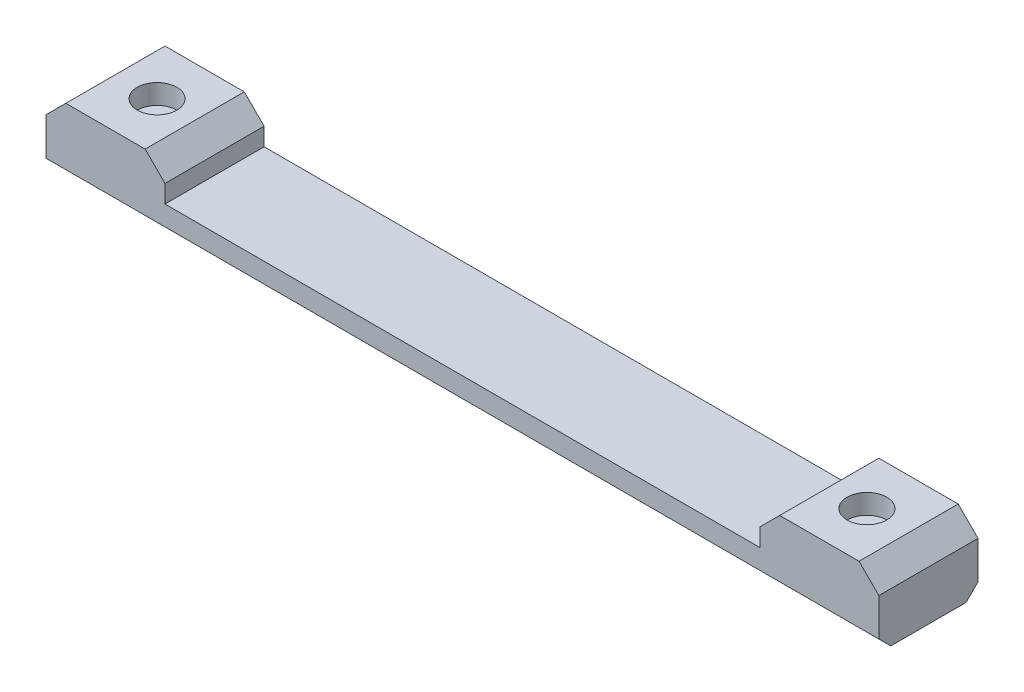
ISO-10303-21;
HEADER;
FILE_DESCRIPTION(('STEP AP214'),'2;1');
FILE_NAME('part.step','',(''),(''),'','','');
FILE_SCHEMA(('AUTOMOTIVE_DESIGN { 1 0 10303 214 1 1 1 1 }'));
ENDSEC;
DATA;
#1=APPLICATION_CONTEXT('core data for automotive mechanical design processes');
#2=APPLICATION_PROTOCOL_DEFINITION('international standard','automotive_design',2000,#1);
#3=PRODUCT_CONTEXT('',#1,'mechanical');
#4=PRODUCT('Part','Part','',(#3));
#5=PRODUCT_RELATED_PRODUCT_CATEGORY('part','',(#4));
#6=PRODUCT_DEFINITION_FORMATION('','',#4);
#7=PRODUCT_DEFINITION_CONTEXT('part definition',#1,'design');
#8=PRODUCT_DEFINITION('design','',#6,#7);
#9=PRODUCT_DEFINITION_SHAPE('','',#8);
#10=(LENGTH_UNIT() NAMED_UNIT(*) SI_UNIT(.MILLI.,.METRE.));
#11=(NAMED_UNIT(*) PLANE_ANGLE_UNIT() SI_UNIT($,.RADIAN.));
#12=(NAMED_UNIT(*) SI_UNIT($,.STERADIAN.) SOLID_ANGLE_UNIT());
#13=UNCERTAINTY_MEASURE_WITH_UNIT(LENGTH_MEASURE(1.E-05),#10,'distance_accuracy_value','');
#14=(GEOMETRIC_REPRESENTATION_CONTEXT(3) GLOBAL_UNCERTAINTY_ASSIGNED_CONTEXT((#13)) GLOBAL_UNIT_ASSIGNED_CONTEXT((#10,
#11,#12)) REPRESENTATION_CONTEXT('',''));
#15=CARTESIAN_POINT('',(0.,0.,0.));
#16=DIRECTION('',(0.,0.,1.));
#17=DIRECTION('',(1.,0.,0.));
#18=AXIS2_PLACEMENT_3D('',#15,#16,#17);
#19=CARTESIAN_POINT('',(0.,9.5,0.));
#20=DIRECTION('',(0.,1.,0.));
#21=DIRECTION('',(0.,0.,1.));
#22=AXIS2_PLACEMENT_3D('',#19,#20,#21);
#23=PLANE('',#22);
#24=CARTESIAN_POINT('',(-89.5,9.5,0.));
#25=DIRECTION('',(0.,1.,0.));
#26=DIRECTION('',(0.,0.,1.));
#27=AXIS2_PLACEMENT_3D('',#24,#25,#26);
#28=CIRCLE('',#27,5.);
#29=CARTESIAN_POINT('',(-89.5,9.5,5.));
#30=VERTEX_POINT('',#29);
#31=EDGE_CURVE('E283',#30,#30,#28,.T.);
#32=ORIENTED_EDGE('',*,*,#31,.F.);
#33=EDGE_LOOP('',(#32));
#34=FACE_BOUND('',#33,.T.);
#35=DIRECTION('',(1.,0.,0.));
#36=VECTOR('',#35,1.);
#37=CARTESIAN_POINT('',(-105.,9.5,12.5));
#38=LINE('',#37,#36);
#39=CARTESIAN_POINT('',(-100.,9.5,12.5));
#40=VERTEX_POINT('',#39);
#41=CARTESIAN_POINT('',(-80.,9.5,12.5));
#42=VERTEX_POINT('',#41);
#43=EDGE_CURVE('E178',#40,#42,#38,.T.);
#44=ORIENTED_EDGE('',*,*,#43,.T.);
#45=DIRECTION('',(0.,0.,-1.));
#46=VECTOR('',#45,1.);
#47=CARTESIAN_POINT('',(-80.,9.5,-12.5));
#48=LINE('',#47,#46);
#49=CARTESIAN_POINT('',(-80.,9.5,-12.5));
#50=VERTEX_POINT('',#49);
#51=EDGE_CURVE('E231',#42,#50,#48,.T.);
#52=ORIENTED_EDGE('',*,*,#51,.T.);
#53=DIRECTION('',(-1.,0.,0.));
#54=VECTOR('',#53,1.);
#55=CARTESIAN_POINT('',(-105.,9.5,-12.5));
#56=LINE('',#55,#54);
#57=CARTESIAN_POINT('',(-100.,9.5,-12.5));
#58=VERTEX_POINT('',#57);
#59=EDGE_CURVE('E181',#50,#58,#56,.T.);
#60=ORIENTED_EDGE('',*,*,#59,.T.);
#61=DIRECTION('',(0.,0.,1.));
#62=VECTOR('',#61,1.);
#63=CARTESIAN_POINT('',(-100.,9.5,0.));
#64=LINE('',#63,#62);
#65=EDGE_CURVE('E228',#58,#40,#64,.T.);
#66=ORIENTED_EDGE('',*,*,#65,.T.);
#67=EDGE_LOOP('',(#44,#52,#60,#66));
#68=FACE_BOUND('',#67,.T.);
#69=ADVANCED_FACE('F39',(#34,#68),#23,.T.);
#70=CARTESIAN_POINT('',(-105.,-8.,-12.5));
#71=DIRECTION('',(-1.,0.,0.));
#72=DIRECTION('',(0.,0.,1.));
#73=AXIS2_PLACEMENT_3D('',#70,#71,#72);
#74=PLANE('',#73);
#75=DIRECTION('',(0.,1.,0.));
#76=VECTOR('',#75,1.);
#77=CARTESIAN_POINT('',(-105.,-8.,-12.5));
#78=LINE('',#77,#76);
#79=CARTESIAN_POINT('',(-105.,-4.99999999999997,-12.5));
#80=VERTEX_POINT('',#79);
#81=CARTESIAN_POINT('',(-105.,4.49999999999998,-12.5));
#82=VERTEX_POINT('',#81);
#83=EDGE_CURVE('E191',#80,#82,#78,.T.);
#84=ORIENTED_EDGE('',*,*,#83,.F.);
#85=DIRECTION('',(0.,-0.707106781186548,0.707106781186547));
#86=VECTOR('',#85,1.);
#87=CARTESIAN_POINT('',(-105.,-6.49999999999998,-11.));
#88=LINE('',#87,#86);
#89=CARTESIAN_POINT('',(-105.,-8.,-9.49999999999997));
#90=VERTEX_POINT('',#89);
#91=EDGE_CURVE('E241',#80,#90,#88,.T.);
#92=ORIENTED_EDGE('',*,*,#91,.T.);
#93=DIRECTION('',(0.,0.,1.));
#94=VECTOR('',#93,1.);
#95=CARTESIAN_POINT('',(-105.,-8.,-12.5));
#96=LINE('',#95,#94);
#97=CARTESIAN_POINT('',(-105.,-8.,9.49999999999994));
#98=VERTEX_POINT('',#97);
#99=EDGE_CURVE('E185',#90,#98,#96,.T.);
#100=ORIENTED_EDGE('',*,*,#99,.T.);
#101=DIRECTION('',(0.,0.707106781186547,0.707106781186548));
#102=VECTOR('',#101,1.);
#103=CARTESIAN_POINT('',(-105.,-19.,-1.50000000000003));
#104=LINE('',#103,#102);
#105=CARTESIAN_POINT('',(-105.,-4.99999999999994,12.5));
#106=VERTEX_POINT('',#105);
#107=EDGE_CURVE('E239',#98,#106,#104,.T.);
#108=ORIENTED_EDGE('',*,*,#107,.T.);
#109=DIRECTION('',(0.,1.,0.));
#110=VECTOR('',#109,1.);
#111=CARTESIAN_POINT('',(-105.,-8.,12.5));
#112=LINE('',#111,#110);
#113=CARTESIAN_POINT('',(-105.,4.49999999999997,12.5));
#114=VERTEX_POINT('',#113);
#115=EDGE_CURVE('E190',#106,#114,#112,.T.);
#116=ORIENTED_EDGE('',*,*,#115,.T.);
#117=DIRECTION('',(0.,0.,-1.));
#118=VECTOR('',#117,1.);
#119=CARTESIAN_POINT('',(-105.,4.49999999999997,-12.5));
#120=LINE('',#119,#118);
#121=EDGE_CURVE('E233',#114,#82,#120,.T.);
#122=ORIENTED_EDGE('',*,*,#121,.T.);
#123=EDGE_LOOP('',(#84,#92,#100,#108,#116,#122));
#124=FACE_BOUND('',#123,.T.);
#125=ADVANCED_FACE('F259',(#124),#74,.T.);
#126=CARTESIAN_POINT('',(-105.,-8.,-12.5));
#127=DIRECTION('',(0.,0.,-1.));
#128=DIRECTION('',(-1.,0.,0.));
#129=AXIS2_PLACEMENT_3D('',#126,#127,#128);
#130=PLANE('',#129);
#131=DIRECTION('',(0.,1.,0.));
#132=VECTOR('',#131,1.);
#133=CARTESIAN_POINT('',(105.,-8.,-12.5));
#134=LINE('',#133,#132);
#135=CARTESIAN_POINT('',(105.,-4.99999999999997,-12.5));
#136=VERTEX_POINT('',#135);
#137=CARTESIAN_POINT('',(105.,4.49999999999997,-12.5));
#138=VERTEX_POINT('',#137);
#139=EDGE_CURVE('E194',#136,#138,#134,.T.);
#140=ORIENTED_EDGE('',*,*,#139,.F.);
#141=DIRECTION('',(-1.,0.,0.));
#142=VECTOR('',#141,1.);
#143=CARTESIAN_POINT('',(-105.,-4.99999999999997,-12.5));
#144=LINE('',#143,#142);
#145=EDGE_CURVE('E236',#136,#80,#144,.T.);
#146=ORIENTED_EDGE('',*,*,#145,.T.);
#147=ORIENTED_EDGE('',*,*,#83,.T.);
#148=DIRECTION('',(-0.707106781186546,-0.707106781186549,0.));
#149=VECTOR('',#148,1.);
#150=CARTESIAN_POINT('',(-111.25,-1.75000000000005,-12.5));
#151=LINE('',#150,#149);
#152=EDGE_CURVE('E203',#82,#58,#151,.F.);
#153=ORIENTED_EDGE('',*,*,#152,.T.);
#154=ORIENTED_EDGE('',*,*,#59,.F.);
#155=DIRECTION('',(0.707106781186548,-0.707106781186547,0.));
#156=VECTOR('',#155,1.);
#157=CARTESIAN_POINT('',(-83.75,13.25,-12.5));
#158=LINE('',#157,#156);
#159=CARTESIAN_POINT('',(-75.,4.49999999999996,-12.5));
#160=VERTEX_POINT('',#159);
#161=EDGE_CURVE('E205',#50,#160,#158,.T.);
#162=ORIENTED_EDGE('',*,*,#161,.T.);
#163=DIRECTION('',(0.,1.,0.));
#164=VECTOR('',#163,1.);
#165=CARTESIAN_POINT('',(-75.,-160.069063257455,-12.5));
#166=LINE('',#165,#164);
#167=CARTESIAN_POINT('',(-75.,0.,-12.5));
#168=VERTEX_POINT('',#167);
#169=EDGE_CURVE('E155',#168,#160,#166,.T.);
#170=ORIENTED_EDGE('',*,*,#169,.F.);
#171=DIRECTION('',(1.,0.,0.));
#172=VECTOR('',#171,1.);
#173=CARTESIAN_POINT('',(-75.,0.,-12.5));
#174=LINE('',#173,#172);
#175=CARTESIAN_POINT('',(75.,0.,-12.5));
#176=VERTEX_POINT('',#175);
#177=EDGE_CURVE('E154',#168,#176,#174,.T.);
#178=ORIENTED_EDGE('',*,*,#177,.T.);
#179=DIRECTION('',(0.,1.,0.));
#180=VECTOR('',#179,1.);
#181=CARTESIAN_POINT('',(75.,-160.069063257455,-12.5));
#182=LINE('',#181,#180);
#183=CARTESIAN_POINT('',(75.,4.49999999999996,-12.5));
#184=VERTEX_POINT('',#183);
#185=EDGE_CURVE('E150',#176,#184,#182,.T.);
#186=ORIENTED_EDGE('',*,*,#185,.T.);
#187=DIRECTION('',(0.707106781186548,0.707106781186547,0.));
#188=VECTOR('',#187,1.);
#189=CARTESIAN_POINT('',(-21.2500000000001,-91.75,-12.5));
#190=LINE('',#189,#188);
#191=CARTESIAN_POINT('',(80.,9.5,-12.5));
#192=VERTEX_POINT('',#191);
#193=EDGE_CURVE('E207',#184,#192,#190,.T.);
#194=ORIENTED_EDGE('',*,*,#193,.T.);
#195=CARTESIAN_POINT('',(100.,9.5,-12.5));
#196=VERTEX_POINT('',#195);
#197=EDGE_CURVE('E184',#196,#192,#56,.T.);
#198=ORIENTED_EDGE('',*,*,#197,.F.);
#199=DIRECTION('',(-0.707106781186546,0.707106781186549,0.));
#200=VECTOR('',#199,1.);
#201=CARTESIAN_POINT('',(6.25000000000057,103.25,-12.5));
#202=LINE('',#201,#200);
#203=EDGE_CURVE('E209',#196,#138,#202,.F.);
#204=ORIENTED_EDGE('',*,*,#203,.T.);
#205=EDGE_LOOP('',(#140,#146,#147,#153,#154,#162,#170,#178,#186,#194,#198,#204));
#206=FACE_BOUND('',#205,.T.);
#207=ADVANCED_FACE('F253',(#206),#130,.T.);
#208=CARTESIAN_POINT('',(105.,-8.,-12.5));
#209=DIRECTION('',(1.,0.,0.));
#210=DIRECTION('',(0.,0.,-1.));
#211=AXIS2_PLACEMENT_3D('',#208,#209,#210);
#212=PLANE('',#211);
#213=DIRECTION('',(0.,0.,-1.));
#214=VECTOR('',#213,1.);
#215=CARTESIAN_POINT('',(105.,-8.,-12.5));
#216=LINE('',#215,#214);
#217=CARTESIAN_POINT('',(105.,-8.,9.49999999999992));
#218=VERTEX_POINT('',#217);
#219=CARTESIAN_POINT('',(105.,-8.,-9.5));
#220=VERTEX_POINT('',#219);
#221=EDGE_CURVE('E188',#218,#220,#216,.T.);
#222=ORIENTED_EDGE('',*,*,#221,.T.);
#223=DIRECTION('',(0.,0.707106781186548,-0.707106781186547));
#224=VECTOR('',#223,1.);
#225=CARTESIAN_POINT('',(105.,-6.49999999999998,-11.));
#226=LINE('',#225,#224);
#227=EDGE_CURVE('E47',#220,#136,#226,.T.);
#228=ORIENTED_EDGE('',*,*,#227,.T.);
#229=ORIENTED_EDGE('',*,*,#139,.T.);
#230=DIRECTION('',(0.,0.,1.));
#231=VECTOR('',#230,1.);
#232=CARTESIAN_POINT('',(105.,4.49999999999997,-12.5));
#233=LINE('',#232,#231);
#234=CARTESIAN_POINT('',(105.,4.5,12.5));
#235=VERTEX_POINT('',#234);
#236=EDGE_CURVE('E212',#138,#235,#233,.T.);
#237=ORIENTED_EDGE('',*,*,#236,.T.);
#238=DIRECTION('',(0.,1.,0.));
#239=VECTOR('',#238,1.);
#240=CARTESIAN_POINT('',(105.,-8.,12.5));
#241=LINE('',#240,#239);
#242=CARTESIAN_POINT('',(105.,-4.99999999999994,12.5));
#243=VERTEX_POINT('',#242);
#244=EDGE_CURVE('E196',#243,#235,#241,.T.);
#245=ORIENTED_EDGE('',*,*,#244,.F.);
#246=DIRECTION('',(0.,-0.707106781186547,-0.707106781186548));
#247=VECTOR('',#246,1.);
#248=CARTESIAN_POINT('',(105.,-19.,-1.50000000000006));
#249=LINE('',#248,#247);
#250=EDGE_CURVE('E54',#243,#218,#249,.T.);
#251=ORIENTED_EDGE('',*,*,#250,.T.);
#252=EDGE_LOOP('',(#222,#228,#229,#237,#245,#251));
#253=FACE_BOUND('',#252,.T.);
#254=ADVANCED_FACE('F249',(#253),#212,.T.);
#255=CARTESIAN_POINT('',(-105.,-8.,12.5));
#256=DIRECTION('',(0.,0.,1.));
#257=DIRECTION('',(1.,0.,0.));
#258=AXIS2_PLACEMENT_3D('',#255,#256,#257);
#259=PLANE('',#258);
#260=ORIENTED_EDGE('',*,*,#115,.F.);
#261=DIRECTION('',(1.,0.,0.));
#262=VECTOR('',#261,1.);
#263=CARTESIAN_POINT('',(105.,-4.99999999999994,12.5));
#264=LINE('',#263,#262);
#265=EDGE_CURVE('E12',#106,#243,#264,.T.);
#266=ORIENTED_EDGE('',*,*,#265,.T.);
#267=ORIENTED_EDGE('',*,*,#244,.T.);
#268=DIRECTION('',(0.707106781186546,-0.707106781186549,0.));
#269=VECTOR('',#268,1.);
#270=CARTESIAN_POINT('',(6.25000000000057,103.25,12.5));
#271=LINE('',#270,#269);
#272=CARTESIAN_POINT('',(100.,9.5,12.5));
#273=VERTEX_POINT('',#272);
#274=EDGE_CURVE('E221',#235,#273,#271,.F.);
#275=ORIENTED_EDGE('',*,*,#274,.T.);
#276=CARTESIAN_POINT('',(80.,9.5,12.5));
#277=VERTEX_POINT('',#276);
#278=EDGE_CURVE('E164',#277,#273,#38,.T.);
#279=ORIENTED_EDGE('',*,*,#278,.F.);
#280=DIRECTION('',(-0.707106781186548,-0.707106781186547,0.));
#281=VECTOR('',#280,1.);
#282=CARTESIAN_POINT('',(-21.2500000000001,-91.75,12.5));
#283=LINE('',#282,#281);
#284=CARTESIAN_POINT('',(75.,4.49999999999996,12.5));
#285=VERTEX_POINT('',#284);
#286=EDGE_CURVE('E170',#277,#285,#283,.T.);
#287=ORIENTED_EDGE('',*,*,#286,.T.);
#288=DIRECTION('',(0.,1.,0.));
#289=VECTOR('',#288,1.);
#290=CARTESIAN_POINT('',(75.,-160.069063257455,12.5));
#291=LINE('',#290,#289);
#292=CARTESIAN_POINT('',(75.,0.,12.5));
#293=VERTEX_POINT('',#292);
#294=EDGE_CURVE('E147',#293,#285,#291,.T.);
#295=ORIENTED_EDGE('',*,*,#294,.F.);
#296=DIRECTION('',(-1.,0.,0.));
#297=VECTOR('',#296,1.);
#298=CARTESIAN_POINT('',(-75.,0.,12.5));
#299=LINE('',#298,#297);
#300=CARTESIAN_POINT('',(-75.,0.,12.5));
#301=VERTEX_POINT('',#300);
#302=EDGE_CURVE('E158',#293,#301,#299,.T.);
#303=ORIENTED_EDGE('',*,*,#302,.T.);
#304=DIRECTION('',(0.,1.,0.));
#305=VECTOR('',#304,1.);
#306=CARTESIAN_POINT('',(-75.,-160.069063257455,12.5));
#307=LINE('',#306,#305);
#308=CARTESIAN_POINT('',(-75.,4.49999999999996,12.5));
#309=VERTEX_POINT('',#308);
#310=EDGE_CURVE('E171',#301,#309,#307,.T.);
#311=ORIENTED_EDGE('',*,*,#310,.T.);
#312=DIRECTION('',(-0.707106781186548,0.707106781186547,0.));
#313=VECTOR('',#312,1.);
#314=CARTESIAN_POINT('',(-83.75,13.25,12.5));
#315=LINE('',#314,#313);
#316=EDGE_CURVE('E218',#309,#42,#315,.T.);
#317=ORIENTED_EDGE('',*,*,#316,.T.);
#318=ORIENTED_EDGE('',*,*,#43,.F.);
#319=DIRECTION('',(0.707106781186546,0.707106781186549,0.));
#320=VECTOR('',#319,1.);
#321=CARTESIAN_POINT('',(-111.25,-1.75000000000005,12.5));
#322=LINE('',#321,#320);
#323=EDGE_CURVE('E215',#40,#114,#322,.F.);
#324=ORIENTED_EDGE('',*,*,#323,.T.);
#325=EDGE_LOOP('',(#260,#266,#267,#275,#279,#287,#295,#303,#311,#317,#318,#324));
#326=FACE_BOUND('',#325,.T.);
#327=ADVANCED_FACE('F167',(#326),#259,.T.);
#328=CARTESIAN_POINT('',(0.,-8.,0.));
#329=DIRECTION('',(0.,1.,0.));
#330=DIRECTION('',(0.,0.,1.));
#331=AXIS2_PLACEMENT_3D('',#328,#329,#330);
#332=PLANE('',#331);
#333=ORIENTED_EDGE('',*,*,#99,.F.);
#334=DIRECTION('',(1.,0.,0.));
#335=VECTOR('',#334,1.);
#336=CARTESIAN_POINT('',(105.,-8.,-9.5));
#337=LINE('',#336,#335);
#338=EDGE_CURVE('E61',#90,#220,#337,.T.);
#339=ORIENTED_EDGE('',*,*,#338,.T.);
#340=ORIENTED_EDGE('',*,*,#221,.F.);
#341=DIRECTION('',(-1.,0.,0.));
#342=VECTOR('',#341,1.);
#343=CARTESIAN_POINT('',(-105.,-8.,9.49999999999994));
#344=LINE('',#343,#342);
#345=EDGE_CURVE('E243',#218,#98,#344,.T.);
#346=ORIENTED_EDGE('',*,*,#345,.T.);
#347=EDGE_LOOP('',(#333,#339,#340,#346));
#348=FACE_BOUND('',#347,.T.);
#349=ADVANCED_FACE('F261',(#348),#332,.F.);
#350=CARTESIAN_POINT('',(89.5,9.5,0.));
#351=DIRECTION('',(0.,1.,0.));
#352=DIRECTION('',(0.,0.,-1.));
#353=AXIS2_PLACEMENT_3D('',#350,#351,#352);
#354=CIRCLE('',#353,5.);
#355=CARTESIAN_POINT('',(89.5,9.5,-5.00000000000003));
#356=VERTEX_POINT('',#355);
#357=EDGE_CURVE('E289',#356,#356,#354,.T.);
#358=ORIENTED_EDGE('',*,*,#357,.F.);
#359=EDGE_LOOP('',(#358));
#360=FACE_BOUND('',#359,.T.);
#361=ORIENTED_EDGE('',*,*,#278,.T.);
#362=DIRECTION('',(0.,0.,-1.));
#363=VECTOR('',#362,1.);
#364=CARTESIAN_POINT('',(100.,9.5,0.));
#365=LINE('',#364,#363);
#366=EDGE_CURVE('E200',#273,#196,#365,.T.);
#367=ORIENTED_EDGE('',*,*,#366,.T.);
#368=ORIENTED_EDGE('',*,*,#197,.T.);
#369=DIRECTION('',(0.,0.,1.));
#370=VECTOR('',#369,1.);
#371=CARTESIAN_POINT('',(80.,9.5,12.5));
#372=LINE('',#371,#370);
#373=EDGE_CURVE('E193',#192,#277,#372,.T.);
#374=ORIENTED_EDGE('',*,*,#373,.T.);
#375=EDGE_LOOP('',(#361,#367,#368,#374));
#376=FACE_BOUND('',#375,.T.);
#377=ADVANCED_FACE('F304',(#360,#376),#23,.T.);
#378=CARTESIAN_POINT('',(-75.,-160.069063257455,-12.5));
#379=DIRECTION('',(-1.,0.,0.));
#380=DIRECTION('',(0.,0.,1.));
#381=AXIS2_PLACEMENT_3D('',#378,#379,#380);
#382=PLANE('',#381);
#383=ORIENTED_EDGE('',*,*,#169,.T.);
#384=DIRECTION('',(0.,0.,1.));
#385=VECTOR('',#384,1.);
#386=CARTESIAN_POINT('',(-75.,4.49999999999998,12.5));
#387=LINE('',#386,#385);
#388=EDGE_CURVE('E225',#160,#309,#387,.T.);
#389=ORIENTED_EDGE('',*,*,#388,.T.);
#390=ORIENTED_EDGE('',*,*,#310,.F.);
#391=DIRECTION('',(0.,0.,-1.));
#392=VECTOR('',#391,1.);
#393=CARTESIAN_POINT('',(-75.,0.,-12.5));
#394=LINE('',#393,#392);
#395=EDGE_CURVE('E160',#301,#168,#394,.T.);
#396=ORIENTED_EDGE('',*,*,#395,.T.);
#397=EDGE_LOOP('',(#383,#389,#390,#396));
#398=FACE_BOUND('',#397,.T.);
#399=ADVANCED_FACE('F279',(#398),#382,.F.);
#400=CARTESIAN_POINT('',(75.,-160.069063257455,-12.5));
#401=DIRECTION('',(1.,0.,0.));
#402=DIRECTION('',(0.,0.,-1.));
#403=AXIS2_PLACEMENT_3D('',#400,#401,#402);
#404=PLANE('',#403);
#405=ORIENTED_EDGE('',*,*,#294,.T.);
#406=DIRECTION('',(0.,0.,-1.));
#407=VECTOR('',#406,1.);
#408=CARTESIAN_POINT('',(75.,4.49999999999998,-12.5));
#409=LINE('',#408,#407);
#410=EDGE_CURVE('E223',#285,#184,#409,.T.);
#411=ORIENTED_EDGE('',*,*,#410,.T.);
#412=ORIENTED_EDGE('',*,*,#185,.F.);
#413=DIRECTION('',(0.,0.,1.));
#414=VECTOR('',#413,1.);
#415=CARTESIAN_POINT('',(75.,0.,-12.5));
#416=LINE('',#415,#414);
#417=EDGE_CURVE('E142',#176,#293,#416,.T.);
#418=ORIENTED_EDGE('',*,*,#417,.T.);
#419=EDGE_LOOP('',(#405,#411,#412,#418));
#420=FACE_BOUND('',#419,.T.);
#421=ADVANCED_FACE('F144',(#420),#404,.F.);
#422=CARTESIAN_POINT('',(0.,0.,0.));
#423=DIRECTION('',(0.,1.,0.));
#424=DIRECTION('',(0.,0.,1.));
#425=AXIS2_PLACEMENT_3D('',#422,#423,#424);
#426=PLANE('',#425);
#427=ORIENTED_EDGE('',*,*,#395,.F.);
#428=ORIENTED_EDGE('',*,*,#302,.F.);
#429=ORIENTED_EDGE('',*,*,#417,.F.);
#430=ORIENTED_EDGE('',*,*,#177,.F.);
#431=EDGE_LOOP('',(#427,#428,#429,#430));
#432=FACE_BOUND('',#431,.T.);
#433=ADVANCED_FACE('F159',(#432),#426,.T.);
#434=CARTESIAN_POINT('',(-89.5,4.5,0.));
#435=DIRECTION('',(0.,1.,0.));
#436=DIRECTION('',(0.,0.,1.));
#437=AXIS2_PLACEMENT_3D('',#434,#435,#436);
#438=CYLINDRICAL_SURFACE('',#437,5.);
#439=CARTESIAN_POINT('',(-89.5,4.5,0.));
#440=DIRECTION('',(0.,1.,0.));
#441=DIRECTION('',(0.,0.,1.));
#442=AXIS2_PLACEMENT_3D('',#439,#440,#441);
#443=CIRCLE('',#442,5.);
#444=CARTESIAN_POINT('',(-89.5,4.5,5.));
#445=VERTEX_POINT('',#444);
#446=EDGE_CURVE('E174',#445,#445,#443,.T.);
#447=ORIENTED_EDGE('',*,*,#446,.F.);
#448=EDGE_LOOP('',(#447));
#449=FACE_BOUND('',#448,.T.);
#450=ORIENTED_EDGE('',*,*,#31,.T.);
#451=EDGE_LOOP('',(#450));
#452=FACE_BOUND('',#451,.T.);
#453=ADVANCED_FACE('F371',(#449,#452),#438,.F.);
#454=CARTESIAN_POINT('',(-89.5,4.5,0.));
#455=DIRECTION('',(0.,1.,0.));
#456=DIRECTION('',(0.,0.,1.));
#457=AXIS2_PLACEMENT_3D('',#454,#455,#456);
#458=PLANE('',#457);
#459=ORIENTED_EDGE('',*,*,#446,.T.);
#460=EDGE_LOOP('',(#459));
#461=FACE_BOUND('',#460,.T.);
#462=ADVANCED_FACE('F300',(#461),#458,.T.);
#463=CARTESIAN_POINT('',(89.5,4.5,0.));
#464=DIRECTION('',(0.,1.,0.));
#465=DIRECTION('',(0.,0.,1.));
#466=AXIS2_PLACEMENT_3D('',#463,#464,#465);
#467=CYLINDRICAL_SURFACE('',#466,5.);
#468=CARTESIAN_POINT('',(89.5,4.5,0.));
#469=DIRECTION('',(0.,1.,0.));
#470=DIRECTION('',(0.,0.,-1.));
#471=AXIS2_PLACEMENT_3D('',#468,#469,#470);
#472=CIRCLE('',#471,5.);
#473=CARTESIAN_POINT('',(89.5,4.5,-5.00000000000003));
#474=VERTEX_POINT('',#473);
#475=EDGE_CURVE('E286',#474,#474,#472,.T.);
#476=ORIENTED_EDGE('',*,*,#475,.F.);
#477=EDGE_LOOP('',(#476));
#478=FACE_BOUND('',#477,.T.);
#479=ORIENTED_EDGE('',*,*,#357,.T.);
#480=EDGE_LOOP('',(#479));
#481=FACE_BOUND('',#480,.T.);
#482=ADVANCED_FACE('F297',(#478,#481),#467,.F.);
#483=CARTESIAN_POINT('',(89.5,4.5,0.));
#484=DIRECTION('',(0.,-1.,0.));
#485=DIRECTION('',(0.,0.,-1.));
#486=AXIS2_PLACEMENT_3D('',#483,#484,#485);
#487=PLANE('',#486);
#488=ORIENTED_EDGE('',*,*,#475,.T.);
#489=EDGE_LOOP('',(#488));
#490=FACE_BOUND('',#489,.T.);
#491=ADVANCED_FACE('F295',(#490),#487,.F.);
#492=CARTESIAN_POINT('',(100.,9.5,0.));
#493=DIRECTION('',(-0.707106781186549,-0.707106781186545,0.));
#494=DIRECTION('',(0.,0.,-1.));
#495=AXIS2_PLACEMENT_3D('',#492,#493,#494);
#496=PLANE('',#495);
#497=ORIENTED_EDGE('',*,*,#274,.F.);
#498=ORIENTED_EDGE('',*,*,#236,.F.);
#499=ORIENTED_EDGE('',*,*,#203,.F.);
#500=ORIENTED_EDGE('',*,*,#366,.F.);
#501=EDGE_LOOP('',(#497,#498,#499,#500));
#502=FACE_BOUND('',#501,.T.);
#503=ADVANCED_FACE('F314',(#502),#496,.F.);
#504=CARTESIAN_POINT('',(75.,4.49999999999998,-12.5));
#505=DIRECTION('',(-0.707106781186547,0.707106781186548,0.));
#506=DIRECTION('',(0.,0.,1.));
#507=AXIS2_PLACEMENT_3D('',#504,#505,#506);
#508=PLANE('',#507);
#509=ORIENTED_EDGE('',*,*,#286,.F.);
#510=ORIENTED_EDGE('',*,*,#373,.F.);
#511=ORIENTED_EDGE('',*,*,#193,.F.);
#512=ORIENTED_EDGE('',*,*,#410,.F.);
#513=EDGE_LOOP('',(#509,#510,#511,#512));
#514=FACE_BOUND('',#513,.T.);
#515=ADVANCED_FACE('F316',(#514),#508,.T.);
#516=CARTESIAN_POINT('',(-75.,4.49999999999998,-12.5));
#517=DIRECTION('',(0.707106781186547,0.707106781186548,0.));
#518=DIRECTION('',(0.,0.,-1.));
#519=AXIS2_PLACEMENT_3D('',#516,#517,#518);
#520=PLANE('',#519);
#521=ORIENTED_EDGE('',*,*,#161,.F.);
#522=ORIENTED_EDGE('',*,*,#51,.F.);
#523=ORIENTED_EDGE('',*,*,#316,.F.);
#524=ORIENTED_EDGE('',*,*,#388,.F.);
#525=EDGE_LOOP('',(#521,#522,#523,#524));
#526=FACE_BOUND('',#525,.T.);
#527=ADVANCED_FACE('F274',(#526),#520,.T.);
#528=CARTESIAN_POINT('',(-100.,9.5,0.));
#529=DIRECTION('',(0.707106781186549,-0.707106781186545,0.));
#530=DIRECTION('',(0.,0.,1.));
#531=AXIS2_PLACEMENT_3D('',#528,#529,#530);
#532=PLANE('',#531);
#533=ORIENTED_EDGE('',*,*,#152,.F.);
#534=ORIENTED_EDGE('',*,*,#121,.F.);
#535=ORIENTED_EDGE('',*,*,#323,.F.);
#536=ORIENTED_EDGE('',*,*,#65,.F.);
#537=EDGE_LOOP('',(#533,#534,#535,#536));
#538=FACE_BOUND('',#537,.T.);
#539=ADVANCED_FACE('F268',(#538),#532,.F.);
#540=CARTESIAN_POINT('',(-105.,-4.99999999999997,-12.5));
#541=DIRECTION('',(0.,-0.707106781186547,-0.707106781186547));
#542=DIRECTION('',(1.,0.,0.));
#543=AXIS2_PLACEMENT_3D('',#540,#541,#542);
#544=PLANE('',#543);
#545=ORIENTED_EDGE('',*,*,#227,.F.);
#546=ORIENTED_EDGE('',*,*,#338,.F.);
#547=ORIENTED_EDGE('',*,*,#91,.F.);
#548=ORIENTED_EDGE('',*,*,#145,.F.);
#549=EDGE_LOOP('',(#545,#546,#547,#548));
#550=FACE_BOUND('',#549,.T.);
#551=ADVANCED_FACE('F257',(#550),#544,.T.);
#552=CARTESIAN_POINT('',(-105.,-4.99999999999994,12.5));
#553=DIRECTION('',(0.,-0.707106781186548,0.707106781186547));
#554=DIRECTION('',(-1.,0.,0.));
#555=AXIS2_PLACEMENT_3D('',#552,#553,#554);
#556=PLANE('',#555);
#557=ORIENTED_EDGE('',*,*,#107,.F.);
#558=ORIENTED_EDGE('',*,*,#345,.F.);
#559=ORIENTED_EDGE('',*,*,#250,.F.);
#560=ORIENTED_EDGE('',*,*,#265,.F.);
#561=EDGE_LOOP('',(#557,#558,#559,#560));
#562=FACE_BOUND('',#561,.T.);
#563=ADVANCED_FACE('F41',(#562),#556,.T.);
#564=CLOSED_SHELL('',(#69,#125,#207,#254,#327,#349,#377,#399,#421,#433,#453,#462,#482,#491,#503,
#515,#527,#539,#551,#563));
#565=MANIFOLD_SOLID_BREP('B2',#564);
#566=ADVANCED_BREP_SHAPE_REPRESENTATION('',(#18,#565),#14);
#567=SHAPE_DEFINITION_REPRESENTATION(#9,#566);
ENDSEC;
END-ISO-10303-21;
